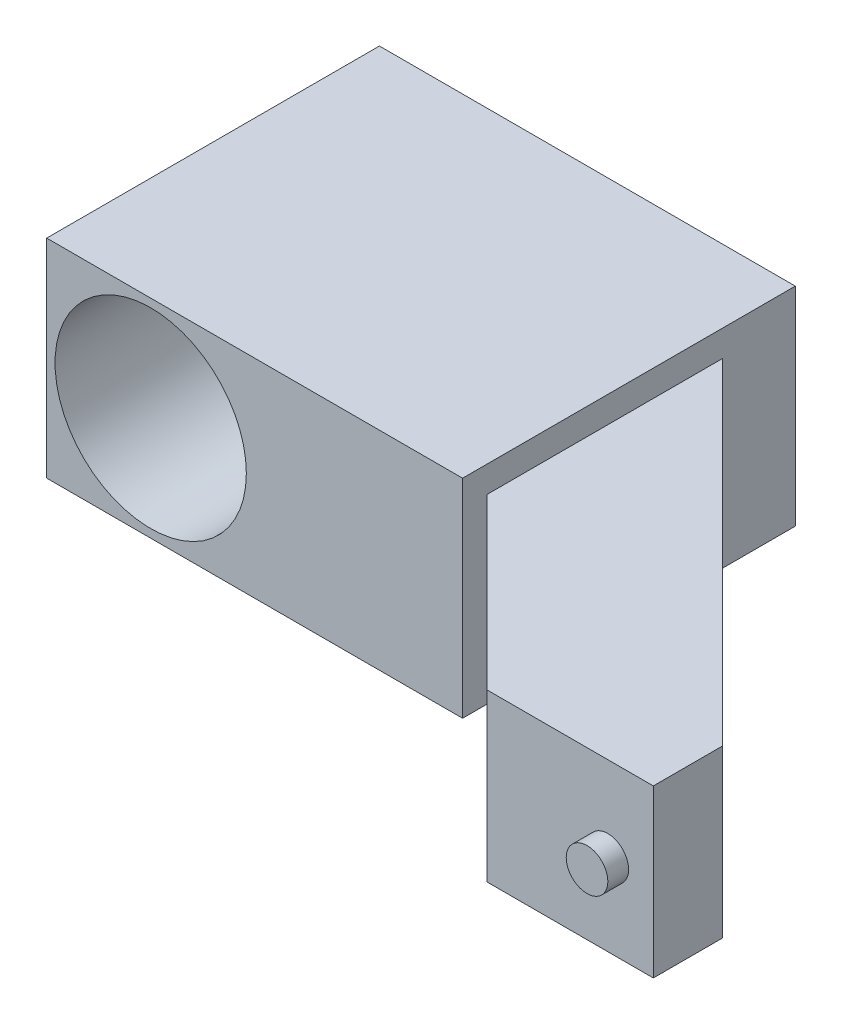
ISO-10303-21;
HEADER;
FILE_DESCRIPTION(('STEP AP214'),'2;1');
FILE_NAME('part.step','',(''),(''),'','','');
FILE_SCHEMA(('AUTOMOTIVE_DESIGN { 1 0 10303 214 1 1 1 1 }'));
ENDSEC;
DATA;
#1=APPLICATION_CONTEXT('core data for automotive mechanical design processes');
#2=APPLICATION_PROTOCOL_DEFINITION('international standard','automotive_design',2000,#1);
#3=PRODUCT_CONTEXT('',#1,'mechanical');
#4=PRODUCT('Part','Part','',(#3));
#5=PRODUCT_RELATED_PRODUCT_CATEGORY('part','',(#4));
#6=PRODUCT_DEFINITION_FORMATION('','',#4);
#7=PRODUCT_DEFINITION_CONTEXT('part definition',#1,'design');
#8=PRODUCT_DEFINITION('design','',#6,#7);
#9=PRODUCT_DEFINITION_SHAPE('','',#8);
#10=(LENGTH_UNIT() NAMED_UNIT(*) SI_UNIT(.MILLI.,.METRE.));
#11=(NAMED_UNIT(*) PLANE_ANGLE_UNIT() SI_UNIT($,.RADIAN.));
#12=(NAMED_UNIT(*) SI_UNIT($,.STERADIAN.) SOLID_ANGLE_UNIT());
#13=UNCERTAINTY_MEASURE_WITH_UNIT(LENGTH_MEASURE(1.E-05),#10,'distance_accuracy_value','');
#14=(GEOMETRIC_REPRESENTATION_CONTEXT(3) GLOBAL_UNCERTAINTY_ASSIGNED_CONTEXT((#13)) GLOBAL_UNIT_ASSIGNED_CONTEXT((#10,
#11,#12)) REPRESENTATION_CONTEXT('',''));
#15=CARTESIAN_POINT('',(0.,0.,0.));
#16=DIRECTION('',(0.,0.,1.));
#17=DIRECTION('',(1.,0.,0.));
#18=AXIS2_PLACEMENT_3D('',#15,#16,#17);
#19=CARTESIAN_POINT('',(0.,24.9862776733587,80.));
#20=DIRECTION('',(-1.,0.,0.));
#21=DIRECTION('',(0.,-1.,0.));
#22=AXIS2_PLACEMENT_3D('',#19,#20,#21);
#23=PLANE('',#22);
#24=DIRECTION('',(0.,1.,0.));
#25=VECTOR('',#24,1.);
#26=CARTESIAN_POINT('',(0.,24.9862776733587,0.));
#27=LINE('',#26,#25);
#28=CARTESIAN_POINT('',(0.,-25.0137223266413,0.));
#29=VERTEX_POINT('',#28);
#30=CARTESIAN_POINT('',(0.,24.9862776733587,0.));
#31=VERTEX_POINT('',#30);
#32=EDGE_CURVE('E162',#29,#31,#27,.T.);
#33=ORIENTED_EDGE('',*,*,#32,.T.);
#34=DIRECTION('',(0.,0.,-1.));
#35=VECTOR('',#34,1.);
#36=CARTESIAN_POINT('',(0.,24.9862776733587,80.));
#37=LINE('',#36,#35);
#38=CARTESIAN_POINT('',(0.,24.9862776733587,80.));
#39=VERTEX_POINT('',#38);
#40=EDGE_CURVE('E167',#39,#31,#37,.T.);
#41=ORIENTED_EDGE('',*,*,#40,.F.);
#42=DIRECTION('',(0.,1.,0.));
#43=VECTOR('',#42,1.);
#44=CARTESIAN_POINT('',(0.,24.9862776733587,80.));
#45=LINE('',#44,#43);
#46=CARTESIAN_POINT('',(0.,-25.0137223266413,80.));
#47=VERTEX_POINT('',#46);
#48=EDGE_CURVE('E153',#47,#39,#45,.T.);
#49=ORIENTED_EDGE('',*,*,#48,.F.);
#50=DIRECTION('',(0.,0.,-1.));
#51=VECTOR('',#50,1.);
#52=CARTESIAN_POINT('',(0.,-25.0137223266413,80.));
#53=LINE('',#52,#51);
#54=EDGE_CURVE('E170',#47,#29,#53,.T.);
#55=ORIENTED_EDGE('',*,*,#54,.T.);
#56=EDGE_LOOP('',(#33,#41,#49,#55));
#57=FACE_BOUND('',#56,.T.);
#58=DIRECTION('',(0.,0.,1.));
#59=VECTOR('',#58,1.);
#60=CARTESIAN_POINT('',(0.,18.6574410532501,80.));
#61=LINE('',#60,#59);
#62=CARTESIAN_POINT('',(0.,18.6574410532501,17.5156434587578));
#63=VERTEX_POINT('',#62);
#64=CARTESIAN_POINT('',(0.,18.6574410532501,74.0841859536809));
#65=VERTEX_POINT('',#64);
#66=EDGE_CURVE('E47',#63,#65,#61,.T.);
#67=ORIENTED_EDGE('',*,*,#66,.F.);
#68=DIRECTION('',(0.,1.,0.));
#69=VECTOR('',#68,1.);
#70=CARTESIAN_POINT('',(0.,24.9862776733587,17.5156434587578));
#71=LINE('',#70,#69);
#72=CARTESIAN_POINT('',(0.,-21.3425589467499,17.5156434587578));
#73=VERTEX_POINT('',#72);
#74=EDGE_CURVE('E176',#73,#63,#71,.T.);
#75=ORIENTED_EDGE('',*,*,#74,.F.);
#76=DIRECTION('',(0.,0.,-1.));
#77=VECTOR('',#76,1.);
#78=CARTESIAN_POINT('',(0.,-21.3425589467499,80.));
#79=LINE('',#78,#77);
#80=CARTESIAN_POINT('',(0.,-21.3425589467499,74.0841859536809));
#81=VERTEX_POINT('',#80);
#82=EDGE_CURVE('E179',#81,#73,#79,.T.);
#83=ORIENTED_EDGE('',*,*,#82,.F.);
#84=DIRECTION('',(0.,-1.,0.));
#85=VECTOR('',#84,1.);
#86=CARTESIAN_POINT('',(0.,24.9862776733587,74.0841859536809));
#87=LINE('',#86,#85);
#88=EDGE_CURVE('E181',#65,#81,#87,.T.);
#89=ORIENTED_EDGE('',*,*,#88,.F.);
#90=EDGE_LOOP('',(#67,#75,#83,#89));
#91=FACE_BOUND('',#90,.T.);
#92=ADVANCED_FACE('F38',(#57,#91),#23,.F.);
#93=CARTESIAN_POINT('',(-100.,24.9862776733587,80.));
#94=DIRECTION('',(1.,0.,0.));
#95=DIRECTION('',(0.,0.,-1.));
#96=AXIS2_PLACEMENT_3D('',#93,#94,#95);
#97=PLANE('',#96);
#98=DIRECTION('',(0.,-1.,0.));
#99=VECTOR('',#98,1.);
#100=CARTESIAN_POINT('',(-100.,24.9862776733587,0.));
#101=LINE('',#100,#99);
#102=CARTESIAN_POINT('',(-100.,24.9862776733587,0.));
#103=VERTEX_POINT('',#102);
#104=CARTESIAN_POINT('',(-100.,-25.0137223266413,0.));
#105=VERTEX_POINT('',#104);
#106=EDGE_CURVE('E146',#103,#105,#101,.T.);
#107=ORIENTED_EDGE('',*,*,#106,.T.);
#108=DIRECTION('',(0.,0.,-1.));
#109=VECTOR('',#108,1.);
#110=CARTESIAN_POINT('',(-100.,-25.0137223266413,80.));
#111=LINE('',#110,#109);
#112=CARTESIAN_POINT('',(-100.,-25.0137223266413,80.));
#113=VERTEX_POINT('',#112);
#114=EDGE_CURVE('E173',#113,#105,#111,.T.);
#115=ORIENTED_EDGE('',*,*,#114,.F.);
#116=DIRECTION('',(0.,-1.,0.));
#117=VECTOR('',#116,1.);
#118=CARTESIAN_POINT('',(-100.,24.9862776733587,80.));
#119=LINE('',#118,#117);
#120=CARTESIAN_POINT('',(-100.,24.9862776733587,80.));
#121=VERTEX_POINT('',#120);
#122=EDGE_CURVE('E147',#121,#113,#119,.T.);
#123=ORIENTED_EDGE('',*,*,#122,.F.);
#124=DIRECTION('',(0.,0.,-1.));
#125=VECTOR('',#124,1.);
#126=CARTESIAN_POINT('',(-100.,24.9862776733587,80.));
#127=LINE('',#126,#125);
#128=EDGE_CURVE('E157',#121,#103,#127,.T.);
#129=ORIENTED_EDGE('',*,*,#128,.T.);
#130=EDGE_LOOP('',(#107,#115,#123,#129));
#131=FACE_BOUND('',#130,.T.);
#132=ADVANCED_FACE('F40',(#131),#97,.F.);
#133=CARTESIAN_POINT('',(-100.,-25.0137223266413,80.));
#134=DIRECTION('',(0.,1.,0.));
#135=DIRECTION('',(0.,0.,1.));
#136=AXIS2_PLACEMENT_3D('',#133,#134,#135);
#137=PLANE('',#136);
#138=DIRECTION('',(1.,0.,0.));
#139=VECTOR('',#138,1.);
#140=CARTESIAN_POINT('',(-100.,-25.0137223266413,0.));
#141=LINE('',#140,#139);
#142=EDGE_CURVE('E160',#105,#29,#141,.T.);
#143=ORIENTED_EDGE('',*,*,#142,.T.);
#144=ORIENTED_EDGE('',*,*,#54,.F.);
#145=DIRECTION('',(1.,0.,0.));
#146=VECTOR('',#145,1.);
#147=CARTESIAN_POINT('',(-100.,-25.0137223266413,80.));
#148=LINE('',#147,#146);
#149=EDGE_CURVE('E150',#113,#47,#148,.T.);
#150=ORIENTED_EDGE('',*,*,#149,.F.);
#151=ORIENTED_EDGE('',*,*,#114,.T.);
#152=EDGE_LOOP('',(#143,#144,#150,#151));
#153=FACE_BOUND('',#152,.T.);
#154=ADVANCED_FACE('F232',(#153),#137,.F.);
#155=CARTESIAN_POINT('',(-100.,24.9862776733587,80.));
#156=DIRECTION('',(0.,-1.,0.));
#157=DIRECTION('',(0.,0.,-1.));
#158=AXIS2_PLACEMENT_3D('',#155,#156,#157);
#159=PLANE('',#158);
#160=DIRECTION('',(-1.,0.,0.));
#161=VECTOR('',#160,1.);
#162=CARTESIAN_POINT('',(-100.,24.9862776733587,0.));
#163=LINE('',#162,#161);
#164=EDGE_CURVE('E151',#31,#103,#163,.T.);
#165=ORIENTED_EDGE('',*,*,#164,.T.);
#166=ORIENTED_EDGE('',*,*,#128,.F.);
#167=DIRECTION('',(-1.,0.,0.));
#168=VECTOR('',#167,1.);
#169=CARTESIAN_POINT('',(-100.,24.9862776733587,80.));
#170=LINE('',#169,#168);
#171=EDGE_CURVE('E155',#39,#121,#170,.T.);
#172=ORIENTED_EDGE('',*,*,#171,.F.);
#173=ORIENTED_EDGE('',*,*,#40,.T.);
#174=EDGE_LOOP('',(#165,#166,#172,#173));
#175=FACE_BOUND('',#174,.T.);
#176=ADVANCED_FACE('F235',(#175),#159,.F.);
#177=CARTESIAN_POINT('',(0.,0.,80.));
#178=DIRECTION('',(0.,0.,1.));
#179=DIRECTION('',(1.,0.,0.));
#180=AXIS2_PLACEMENT_3D('',#177,#178,#179);
#181=PLANE('',#180);
#182=CARTESIAN_POINT('',(-75.,-0.0137223266412669,80.));
#183=DIRECTION('',(0.,0.,1.));
#184=DIRECTION('',(1.,0.,0.));
#185=AXIS2_PLACEMENT_3D('',#182,#183,#184);
#186=CIRCLE('',#185,23.);
#187=CARTESIAN_POINT('',(-52.,-0.0137223266412669,80.));
#188=VERTEX_POINT('',#187);
#189=EDGE_CURVE('E200',#188,#188,#186,.T.);
#190=ORIENTED_EDGE('',*,*,#189,.F.);
#191=EDGE_LOOP('',(#190));
#192=FACE_BOUND('',#191,.T.);
#193=ORIENTED_EDGE('',*,*,#122,.T.);
#194=ORIENTED_EDGE('',*,*,#149,.T.);
#195=ORIENTED_EDGE('',*,*,#48,.T.);
#196=ORIENTED_EDGE('',*,*,#171,.T.);
#197=EDGE_LOOP('',(#193,#194,#195,#196));
#198=FACE_BOUND('',#197,.T.);
#199=ADVANCED_FACE('F242',(#192,#198),#181,.T.);
#200=CARTESIAN_POINT('',(0.,0.,0.));
#201=DIRECTION('',(0.,0.,1.));
#202=DIRECTION('',(1.,0.,0.));
#203=AXIS2_PLACEMENT_3D('',#200,#201,#202);
#204=PLANE('',#203);
#205=CARTESIAN_POINT('',(-75.,-0.0137223266412738,0.));
#206=DIRECTION('',(0.,0.,-1.));
#207=DIRECTION('',(-1.,0.,0.));
#208=AXIS2_PLACEMENT_3D('',#205,#206,#207);
#209=CIRCLE('',#208,2.);
#210=CARTESIAN_POINT('',(-77.,-0.0137223266412738,0.));
#211=VERTEX_POINT('',#210);
#212=EDGE_CURVE('E193',#211,#211,#209,.T.);
#213=ORIENTED_EDGE('',*,*,#212,.F.);
#214=EDGE_LOOP('',(#213));
#215=FACE_BOUND('',#214,.T.);
#216=ORIENTED_EDGE('',*,*,#106,.F.);
#217=ORIENTED_EDGE('',*,*,#164,.F.);
#218=ORIENTED_EDGE('',*,*,#32,.F.);
#219=ORIENTED_EDGE('',*,*,#142,.F.);
#220=EDGE_LOOP('',(#216,#217,#218,#219));
#221=FACE_BOUND('',#220,.T.);
#222=ADVANCED_FACE('F252',(#215,#221),#204,.F.);
#223=CARTESIAN_POINT('',(97.3081954486045,18.6574410532501,114.82383890736));
#224=DIRECTION('',(0.,-1.,0.));
#225=DIRECTION('',(1.,0.,0.));
#226=AXIS2_PLACEMENT_3D('',#223,#224,#225);
#227=PLANE('',#226);
#228=DIRECTION('',(1.,0.,0.));
#229=VECTOR('',#228,1.);
#230=CARTESIAN_POINT('',(97.3081954486045,18.6574410532501,114.82383890736));
#231=LINE('',#230,#229);
#232=CARTESIAN_POINT('',(40.7396529536814,18.6574410532501,114.823838907361));
#233=VERTEX_POINT('',#232);
#234=CARTESIAN_POINT('',(80.68652024659,18.6574410532501,114.82383890736));
#235=VERTEX_POINT('',#234);
#236=EDGE_CURVE('E132',#233,#235,#231,.T.);
#237=ORIENTED_EDGE('',*,*,#236,.T.);
#238=DIRECTION('',(0.,0.,1.));
#239=VECTOR('',#238,1.);
#240=CARTESIAN_POINT('',(80.68652024659,18.6574410532501,94.8238389073623));
#241=LINE('',#240,#239);
#242=CARTESIAN_POINT('',(80.68652024659,18.6574410532501,98.2021637053458));
#243=VERTEX_POINT('',#242);
#244=EDGE_CURVE('E54',#243,#235,#241,.T.);
#245=ORIENTED_EDGE('',*,*,#244,.F.);
#246=DIRECTION('',(-0.707106781186556,0.,-0.707106781186539));
#247=VECTOR('',#246,1.);
#248=CARTESIAN_POINT('',(97.3081954486045,18.6574410532501,114.82383890736));
#249=LINE('',#248,#247);
#250=EDGE_CURVE('E140',#243,#63,#249,.T.);
#251=ORIENTED_EDGE('',*,*,#250,.T.);
#252=ORIENTED_EDGE('',*,*,#66,.T.);
#253=DIRECTION('',(-0.707106781186556,0.,-0.707106781186539));
#254=VECTOR('',#253,1.);
#255=CARTESIAN_POINT('',(69.0239242011429,18.6574410532501,143.108110154822));
#256=LINE('',#255,#254);
#257=EDGE_CURVE('E62',#233,#65,#256,.T.);
#258=ORIENTED_EDGE('',*,*,#257,.F.);
#259=EDGE_LOOP('',(#237,#245,#251,#252,#258));
#260=FACE_BOUND('',#259,.T.);
#261=ADVANCED_FACE('F186',(#260),#227,.F.);
#262=CARTESIAN_POINT('',(69.0239242011429,18.6574410532501,143.108110154822));
#263=DIRECTION('',(0.707106781186539,0.,-0.707106781186556));
#264=DIRECTION('',(-0.707106781186556,0.,-0.707106781186539));
#265=AXIS2_PLACEMENT_3D('',#262,#263,#264);
#266=PLANE('',#265);
#267=DIRECTION('',(-0.707106781186556,0.,-0.707106781186539));
#268=VECTOR('',#267,1.);
#269=CARTESIAN_POINT('',(69.0239242011429,-21.3425589467499,143.108110154822));
#270=LINE('',#269,#268);
#271=CARTESIAN_POINT('',(40.7396529536814,-21.3425589467499,114.823838907361));
#272=VERTEX_POINT('',#271);
#273=EDGE_CURVE('E143',#272,#81,#270,.T.);
#274=ORIENTED_EDGE('',*,*,#273,.F.);
#275=DIRECTION('',(0.,1.,0.));
#276=VECTOR('',#275,1.);
#277=CARTESIAN_POINT('',(40.7396529536814,18.6574410532501,114.823838907361));
#278=LINE('',#277,#276);
#279=EDGE_CURVE('E128',#272,#233,#278,.T.);
#280=ORIENTED_EDGE('',*,*,#279,.T.);
#281=ORIENTED_EDGE('',*,*,#257,.T.);
#282=ORIENTED_EDGE('',*,*,#88,.T.);
#283=EDGE_LOOP('',(#274,#280,#281,#282));
#284=FACE_BOUND('',#283,.T.);
#285=ADVANCED_FACE('F267',(#284),#266,.F.);
#286=CARTESIAN_POINT('',(97.3081954486045,-21.3425589467499,114.82383890736));
#287=DIRECTION('',(0.,1.,0.));
#288=DIRECTION('',(-1.,0.,0.));
#289=AXIS2_PLACEMENT_3D('',#286,#287,#288);
#290=PLANE('',#289);
#291=DIRECTION('',(-0.707106781186556,0.,-0.707106781186539));
#292=VECTOR('',#291,1.);
#293=CARTESIAN_POINT('',(97.3081954486045,-21.3425589467499,114.82383890736));
#294=LINE('',#293,#292);
#295=CARTESIAN_POINT('',(80.68652024659,-21.3425589467499,98.2021637053458));
#296=VERTEX_POINT('',#295);
#297=EDGE_CURVE('E124',#296,#73,#294,.T.);
#298=ORIENTED_EDGE('',*,*,#297,.F.);
#299=DIRECTION('',(0.,0.,1.));
#300=VECTOR('',#299,1.);
#301=CARTESIAN_POINT('',(80.68652024659,-21.3425589467499,94.8238389073623));
#302=LINE('',#301,#300);
#303=CARTESIAN_POINT('',(80.68652024659,-21.3425589467499,114.823838907362));
#304=VERTEX_POINT('',#303);
#305=EDGE_CURVE('E112',#296,#304,#302,.T.);
#306=ORIENTED_EDGE('',*,*,#305,.T.);
#307=DIRECTION('',(-1.,0.,0.));
#308=VECTOR('',#307,1.);
#309=CARTESIAN_POINT('',(97.3081954486045,-21.3425589467499,114.82383890736));
#310=LINE('',#309,#308);
#311=EDGE_CURVE('E121',#304,#272,#310,.T.);
#312=ORIENTED_EDGE('',*,*,#311,.T.);
#313=ORIENTED_EDGE('',*,*,#273,.T.);
#314=ORIENTED_EDGE('',*,*,#82,.T.);
#315=EDGE_LOOP('',(#298,#306,#312,#313,#314));
#316=FACE_BOUND('',#315,.T.);
#317=ADVANCED_FACE('F120',(#316),#290,.F.);
#318=CARTESIAN_POINT('',(97.3081954486045,18.6574410532501,114.82383890736));
#319=DIRECTION('',(-0.707106781186539,0.,0.707106781186556));
#320=DIRECTION('',(0.707106781186556,0.,0.707106781186539));
#321=AXIS2_PLACEMENT_3D('',#318,#319,#320);
#322=PLANE('',#321);
#323=ORIENTED_EDGE('',*,*,#250,.F.);
#324=DIRECTION('',(0.,-1.,0.));
#325=VECTOR('',#324,1.);
#326=CARTESIAN_POINT('',(80.68652024659,18.6574410532501,98.2021637053458));
#327=LINE('',#326,#325);
#328=EDGE_CURVE('E125',#243,#296,#327,.T.);
#329=ORIENTED_EDGE('',*,*,#328,.T.);
#330=ORIENTED_EDGE('',*,*,#297,.T.);
#331=ORIENTED_EDGE('',*,*,#74,.T.);
#332=EDGE_LOOP('',(#323,#329,#330,#331));
#333=FACE_BOUND('',#332,.T.);
#334=ADVANCED_FACE('F192',(#333),#322,.F.);
#335=CARTESIAN_POINT('',(2.79838243576993E-12,0.,114.823838907362));
#336=DIRECTION('',(0.,0.,-1.));
#337=DIRECTION('',(-1.,0.,0.));
#338=AXIS2_PLACEMENT_3D('',#335,#336,#337);
#339=PLANE('',#338);
#340=CARTESIAN_POINT('',(69.7458954448421,-1.7229835667365,114.823838907361));
#341=DIRECTION('',(0.,0.,-1.));
#342=DIRECTION('',(-1.,0.,0.));
#343=AXIS2_PLACEMENT_3D('',#340,#341,#342);
#344=CIRCLE('',#343,5.);
#345=CARTESIAN_POINT('',(64.7458954448421,-1.7229835667365,114.823838907361));
#346=VERTEX_POINT('',#345);
#347=EDGE_CURVE('E11',#346,#346,#344,.F.);
#348=ORIENTED_EDGE('',*,*,#347,.F.);
#349=EDGE_LOOP('',(#348));
#350=FACE_BOUND('',#349,.T.);
#351=ORIENTED_EDGE('',*,*,#311,.F.);
#352=DIRECTION('',(0.,-1.,0.));
#353=VECTOR('',#352,1.);
#354=CARTESIAN_POINT('',(80.68652024659,-21.3425589467499,114.823838907362));
#355=LINE('',#354,#353);
#356=EDGE_CURVE('E109',#235,#304,#355,.T.);
#357=ORIENTED_EDGE('',*,*,#356,.F.);
#358=ORIENTED_EDGE('',*,*,#236,.F.);
#359=ORIENTED_EDGE('',*,*,#279,.F.);
#360=EDGE_LOOP('',(#351,#357,#358,#359));
#361=FACE_BOUND('',#360,.T.);
#362=ADVANCED_FACE('F127',(#350,#361),#339,.F.);
#363=CARTESIAN_POINT('',(69.7458954448421,-1.7229835667365,119.823838907362));
#364=DIRECTION('',(0.,0.,-1.));
#365=DIRECTION('',(-1.,0.,0.));
#366=AXIS2_PLACEMENT_3D('',#363,#364,#365);
#367=CYLINDRICAL_SURFACE('',#366,5.);
#368=CARTESIAN_POINT('',(69.7458954448421,-1.7229835667365,119.823838907362));
#369=DIRECTION('',(0.,0.,1.));
#370=DIRECTION('',(1.,0.,0.));
#371=AXIS2_PLACEMENT_3D('',#368,#369,#370);
#372=CIRCLE('',#371,5.);
#373=CARTESIAN_POINT('',(74.7458954448421,-1.7229835667365,119.823838907362));
#374=VERTEX_POINT('',#373);
#375=EDGE_CURVE('E130',#374,#374,#372,.T.);
#376=ORIENTED_EDGE('',*,*,#375,.F.);
#377=EDGE_LOOP('',(#376));
#378=FACE_BOUND('',#377,.T.);
#379=ORIENTED_EDGE('',*,*,#347,.T.);
#380=EDGE_LOOP('',(#379));
#381=FACE_BOUND('',#380,.T.);
#382=ADVANCED_FACE('F223',(#378,#381),#367,.T.);
#383=CARTESIAN_POINT('',(69.7458954448421,-1.7229835667365,119.823838907362));
#384=DIRECTION('',(0.,0.,1.));
#385=DIRECTION('',(1.,0.,0.));
#386=AXIS2_PLACEMENT_3D('',#383,#384,#385);
#387=PLANE('',#386);
#388=ORIENTED_EDGE('',*,*,#375,.T.);
#389=EDGE_LOOP('',(#388));
#390=FACE_BOUND('',#389,.T.);
#391=ADVANCED_FACE('F218',(#390),#387,.T.);
#392=CARTESIAN_POINT('',(-75.,-0.0137223266412669,2.));
#393=DIRECTION('',(0.,0.,1.));
#394=DIRECTION('',(1.,0.,0.));
#395=AXIS2_PLACEMENT_3D('',#392,#393,#394);
#396=CYLINDRICAL_SURFACE('',#395,23.);
#397=CARTESIAN_POINT('',(-75.,-0.0137223266412669,2.));
#398=DIRECTION('',(0.,0.,1.));
#399=DIRECTION('',(1.,0.,0.));
#400=AXIS2_PLACEMENT_3D('',#397,#398,#399);
#401=CIRCLE('',#400,23.);
#402=CARTESIAN_POINT('',(-52.,-0.0137223266412669,2.));
#403=VERTEX_POINT('',#402);
#404=EDGE_CURVE('E135',#403,#403,#401,.T.);
#405=ORIENTED_EDGE('',*,*,#404,.F.);
#406=EDGE_LOOP('',(#405));
#407=FACE_BOUND('',#406,.T.);
#408=ORIENTED_EDGE('',*,*,#189,.T.);
#409=EDGE_LOOP('',(#408));
#410=FACE_BOUND('',#409,.T.);
#411=ADVANCED_FACE('F213',(#407,#410),#396,.F.);
#412=CARTESIAN_POINT('',(0.,0.,2.));
#413=DIRECTION('',(0.,0.,1.));
#414=DIRECTION('',(1.,0.,0.));
#415=AXIS2_PLACEMENT_3D('',#412,#413,#414);
#416=PLANE('',#415);
#417=CARTESIAN_POINT('',(-75.,-0.0137223266412738,2.));
#418=DIRECTION('',(0.,0.,1.));
#419=DIRECTION('',(1.,0.,0.));
#420=AXIS2_PLACEMENT_3D('',#417,#418,#419);
#421=CIRCLE('',#420,2.);
#422=CARTESIAN_POINT('',(-73.,-0.0137223266412738,2.));
#423=VERTEX_POINT('',#422);
#424=EDGE_CURVE('E42',#423,#423,#421,.T.);
#425=ORIENTED_EDGE('',*,*,#424,.F.);
#426=EDGE_LOOP('',(#425));
#427=FACE_BOUND('',#426,.T.);
#428=ORIENTED_EDGE('',*,*,#404,.T.);
#429=EDGE_LOOP('',(#428));
#430=FACE_BOUND('',#429,.T.);
#431=ADVANCED_FACE('F210',(#427,#430),#416,.T.);
#432=CARTESIAN_POINT('',(-75.,-0.0137223266412738,78.));
#433=DIRECTION('',(0.,0.,-1.));
#434=DIRECTION('',(-1.,0.,0.));
#435=AXIS2_PLACEMENT_3D('',#432,#433,#434);
#436=CYLINDRICAL_SURFACE('',#435,2.);
#437=ORIENTED_EDGE('',*,*,#424,.T.);
#438=EDGE_LOOP('',(#437));
#439=FACE_BOUND('',#438,.T.);
#440=ORIENTED_EDGE('',*,*,#212,.T.);
#441=EDGE_LOOP('',(#440));
#442=FACE_BOUND('',#441,.T.);
#443=ADVANCED_FACE('F207',(#439,#442),#436,.F.);
#444=CARTESIAN_POINT('',(80.68652024659,-21.3425589467499,94.8238389073623));
#445=DIRECTION('',(-1.,0.,0.));
#446=DIRECTION('',(0.,0.,1.));
#447=AXIS2_PLACEMENT_3D('',#444,#445,#446);
#448=PLANE('',#447);
#449=ORIENTED_EDGE('',*,*,#244,.T.);
#450=ORIENTED_EDGE('',*,*,#356,.T.);
#451=ORIENTED_EDGE('',*,*,#305,.F.);
#452=ORIENTED_EDGE('',*,*,#328,.F.);
#453=EDGE_LOOP('',(#449,#450,#451,#452));
#454=FACE_BOUND('',#453,.T.);
#455=ADVANCED_FACE('F111',(#454),#448,.F.);
#456=CLOSED_SHELL('',(#92,#132,#154,#176,#199,#222,#261,#285,#317,#334,#362,#382,#391,#411,#431,
#443,#455));
#457=MANIFOLD_SOLID_BREP('B2',#456);
#458=ADVANCED_BREP_SHAPE_REPRESENTATION('',(#18,#457),#14);
#459=SHAPE_DEFINITION_REPRESENTATION(#9,#458);
ENDSEC;
END-ISO-10303-21;
